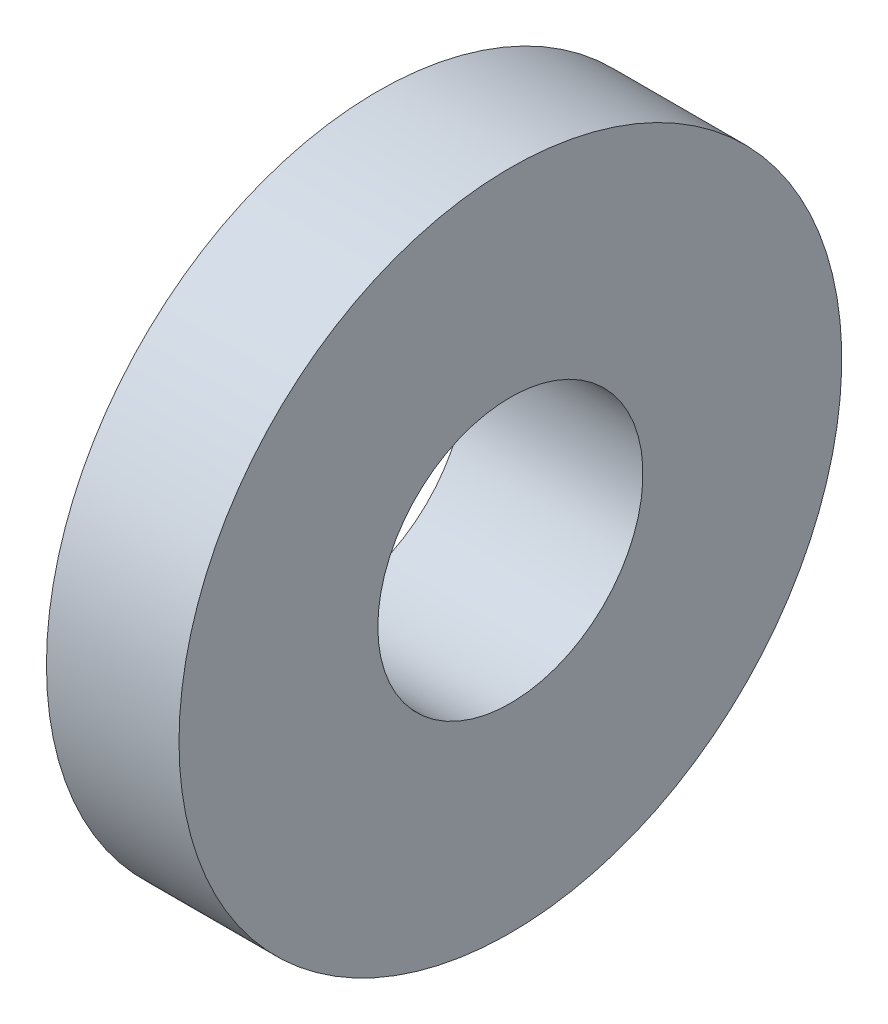
ISO-10303-21;
HEADER;
FILE_DESCRIPTION(('STEP AP214'),'2;1');
FILE_NAME('part.step','',(''),(''),'','','');
FILE_SCHEMA(('AUTOMOTIVE_DESIGN { 1 0 10303 214 1 1 1 1 }'));
ENDSEC;
DATA;
#1=APPLICATION_CONTEXT('core data for automotive mechanical design processes');
#2=APPLICATION_PROTOCOL_DEFINITION('international standard','automotive_design',2000,#1);
#3=PRODUCT_CONTEXT('',#1,'mechanical');
#4=PRODUCT('Part','Part','',(#3));
#5=PRODUCT_RELATED_PRODUCT_CATEGORY('part','',(#4));
#6=PRODUCT_DEFINITION_FORMATION('','',#4);
#7=PRODUCT_DEFINITION_CONTEXT('part definition',#1,'design');
#8=PRODUCT_DEFINITION('design','',#6,#7);
#9=PRODUCT_DEFINITION_SHAPE('','',#8);
#10=(LENGTH_UNIT() NAMED_UNIT(*) SI_UNIT(.MILLI.,.METRE.));
#11=(NAMED_UNIT(*) PLANE_ANGLE_UNIT() SI_UNIT($,.RADIAN.));
#12=(NAMED_UNIT(*) SI_UNIT($,.STERADIAN.) SOLID_ANGLE_UNIT());
#13=UNCERTAINTY_MEASURE_WITH_UNIT(LENGTH_MEASURE(1.E-05),#10,'distance_accuracy_value','');
#14=(GEOMETRIC_REPRESENTATION_CONTEXT(3) GLOBAL_UNCERTAINTY_ASSIGNED_CONTEXT((#13)) GLOBAL_UNIT_ASSIGNED_CONTEXT((#10,
#11,#12)) REPRESENTATION_CONTEXT('',''));
#15=CARTESIAN_POINT('',(0.,0.,0.));
#16=DIRECTION('',(0.,0.,1.));
#17=DIRECTION('',(1.,0.,0.));
#18=AXIS2_PLACEMENT_3D('',#15,#16,#17);
#19=CARTESIAN_POINT('',(0.,0.,0.));
#20=DIRECTION('',(1.,0.,0.));
#21=DIRECTION('',(0.,0.,-1.));
#22=AXIS2_PLACEMENT_3D('',#19,#20,#21);
#23=PLANE('',#22);
#24=CARTESIAN_POINT('',(0.,0.,0.));
#25=DIRECTION('',(-1.,0.,0.));
#26=DIRECTION('',(0.,0.,1.));
#27=AXIS2_PLACEMENT_3D('',#24,#25,#26);
#28=CIRCLE('',#27,1.5);
#29=CARTESIAN_POINT('',(0.,0.,1.5));
#30=VERTEX_POINT('',#29);
#31=EDGE_CURVE('E50',#30,#30,#28,.T.);
#32=ORIENTED_EDGE('',*,*,#31,.F.);
#33=EDGE_LOOP('',(#32));
#34=FACE_BOUND('',#33,.T.);
#35=CARTESIAN_POINT('',(0.,0.,0.));
#36=DIRECTION('',(-1.,0.,0.));
#37=DIRECTION('',(0.,0.,1.));
#38=AXIS2_PLACEMENT_3D('',#35,#36,#37);
#39=CIRCLE('',#38,2.5);
#40=CARTESIAN_POINT('',(0.,0.,2.5));
#41=VERTEX_POINT('',#40);
#42=EDGE_CURVE('E10',#41,#41,#39,.T.);
#43=ORIENTED_EDGE('',*,*,#42,.T.);
#44=EDGE_LOOP('',(#43));
#45=FACE_BOUND('',#44,.T.);
#46=ADVANCED_FACE('F31',(#34,#45),#23,.F.);
#47=CARTESIAN_POINT('',(0.,0.,0.));
#48=DIRECTION('',(-1.,0.,0.));
#49=DIRECTION('',(0.,0.,1.));
#50=AXIS2_PLACEMENT_3D('',#47,#48,#49);
#51=CYLINDRICAL_SURFACE('',#50,2.5);
#52=ORIENTED_EDGE('',*,*,#42,.F.);
#53=EDGE_LOOP('',(#52));
#54=FACE_BOUND('',#53,.T.);
#55=CARTESIAN_POINT('',(0.5,0.,0.));
#56=DIRECTION('',(-1.,0.,0.));
#57=DIRECTION('',(0.,0.,1.));
#58=AXIS2_PLACEMENT_3D('',#55,#56,#57);
#59=CIRCLE('',#58,2.5);
#60=CARTESIAN_POINT('',(0.5,0.,2.5));
#61=VERTEX_POINT('',#60);
#62=EDGE_CURVE('E38',#61,#61,#59,.T.);
#63=ORIENTED_EDGE('',*,*,#62,.T.);
#64=EDGE_LOOP('',(#63));
#65=FACE_BOUND('',#64,.T.);
#66=ADVANCED_FACE('F69',(#54,#65),#51,.T.);
#67=CARTESIAN_POINT('',(0.5,2.5,0.));
#68=DIRECTION('',(1.,0.,0.));
#69=DIRECTION('',(0.,0.,-1.));
#70=AXIS2_PLACEMENT_3D('',#67,#68,#69);
#71=PLANE('',#70);
#72=ORIENTED_EDGE('',*,*,#62,.F.);
#73=EDGE_LOOP('',(#72));
#74=FACE_BOUND('',#73,.T.);
#75=CARTESIAN_POINT('',(0.5,0.,0.));
#76=DIRECTION('',(-1.,0.,0.));
#77=DIRECTION('',(0.,0.,1.));
#78=AXIS2_PLACEMENT_3D('',#75,#76,#77);
#79=CIRCLE('',#78,3.75);
#80=CARTESIAN_POINT('',(0.5,0.,3.75));
#81=VERTEX_POINT('',#80);
#82=EDGE_CURVE('E42',#81,#81,#79,.T.);
#83=ORIENTED_EDGE('',*,*,#82,.T.);
#84=EDGE_LOOP('',(#83));
#85=FACE_BOUND('',#84,.T.);
#86=ADVANCED_FACE('F74',(#74,#85),#71,.F.);
#87=CARTESIAN_POINT('',(0.,0.,0.));
#88=DIRECTION('',(-1.,0.,0.));
#89=DIRECTION('',(0.,0.,1.));
#90=AXIS2_PLACEMENT_3D('',#87,#88,#89);
#91=CYLINDRICAL_SURFACE('',#90,3.75);
#92=ORIENTED_EDGE('',*,*,#82,.F.);
#93=EDGE_LOOP('',(#92));
#94=FACE_BOUND('',#93,.T.);
#95=CARTESIAN_POINT('',(2.,0.,0.));
#96=DIRECTION('',(-1.,0.,0.));
#97=DIRECTION('',(0.,0.,1.));
#98=AXIS2_PLACEMENT_3D('',#95,#96,#97);
#99=CIRCLE('',#98,3.75);
#100=CARTESIAN_POINT('',(2.,0.,3.75));
#101=VERTEX_POINT('',#100);
#102=EDGE_CURVE('E47',#101,#101,#99,.T.);
#103=ORIENTED_EDGE('',*,*,#102,.T.);
#104=EDGE_LOOP('',(#103));
#105=FACE_BOUND('',#104,.T.);
#106=ADVANCED_FACE('F66',(#94,#105),#91,.T.);
#107=CARTESIAN_POINT('',(2.,3.75,0.));
#108=DIRECTION('',(-1.,0.,0.));
#109=DIRECTION('',(0.,0.,1.));
#110=AXIS2_PLACEMENT_3D('',#107,#108,#109);
#111=PLANE('',#110);
#112=CARTESIAN_POINT('',(2.,0.,0.));
#113=DIRECTION('',(-1.,0.,0.));
#114=DIRECTION('',(0.,0.,1.));
#115=AXIS2_PLACEMENT_3D('',#112,#113,#114);
#116=CIRCLE('',#115,1.5);
#117=CARTESIAN_POINT('',(2.,0.,1.5));
#118=VERTEX_POINT('',#117);
#119=EDGE_CURVE('E34',#118,#118,#116,.T.);
#120=ORIENTED_EDGE('',*,*,#119,.T.);
#121=EDGE_LOOP('',(#120));
#122=FACE_BOUND('',#121,.T.);
#123=ORIENTED_EDGE('',*,*,#102,.F.);
#124=EDGE_LOOP('',(#123));
#125=FACE_BOUND('',#124,.T.);
#126=ADVANCED_FACE('F57',(#122,#125),#111,.F.);
#127=CARTESIAN_POINT('',(10.,0.,0.));
#128=DIRECTION('',(-1.,0.,0.));
#129=DIRECTION('',(0.,0.,1.));
#130=AXIS2_PLACEMENT_3D('',#127,#128,#129);
#131=CYLINDRICAL_SURFACE('',#130,1.5);
#132=ORIENTED_EDGE('',*,*,#31,.T.);
#133=EDGE_LOOP('',(#132));
#134=FACE_BOUND('',#133,.T.);
#135=ORIENTED_EDGE('',*,*,#119,.F.);
#136=EDGE_LOOP('',(#135));
#137=FACE_BOUND('',#136,.T.);
#138=ADVANCED_FACE('F60',(#134,#137),#131,.F.);
#139=CLOSED_SHELL('',(#46,#66,#86,#106,#126,#138));
#140=MANIFOLD_SOLID_BREP('B2',#139);
#141=ADVANCED_BREP_SHAPE_REPRESENTATION('',(#18,#140),#14);
#142=SHAPE_DEFINITION_REPRESENTATION(#9,#141);
ENDSEC;
END-ISO-10303-21;
